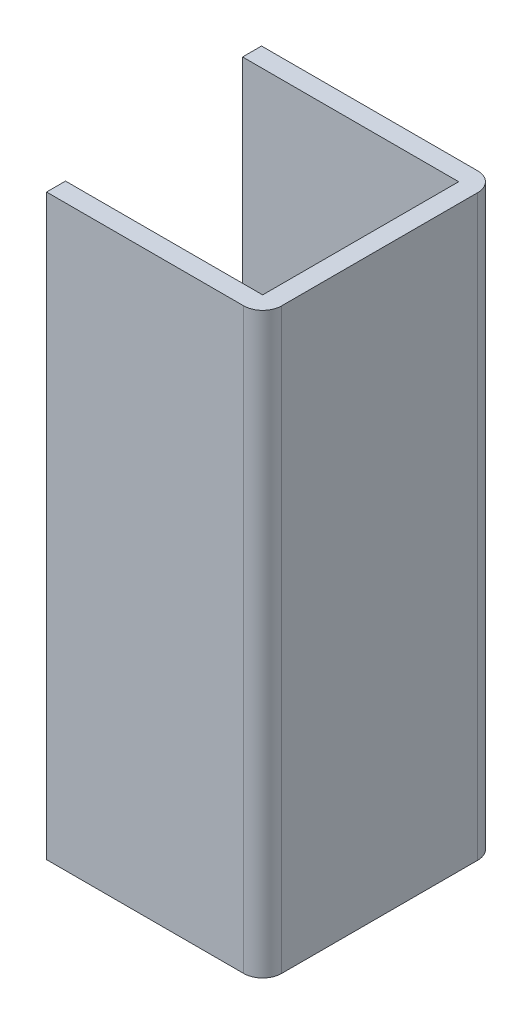
ISO-10303-21;
HEADER;
FILE_DESCRIPTION(('STEP AP214'),'2;1');
FILE_NAME('part.step','',(''),(''),'','','');
FILE_SCHEMA(('AUTOMOTIVE_DESIGN { 1 0 10303 214 1 1 1 1 }'));
ENDSEC;
DATA;
#1=APPLICATION_CONTEXT('core data for automotive mechanical design processes');
#2=APPLICATION_PROTOCOL_DEFINITION('international standard','automotive_design',2000,#1);
#3=PRODUCT_CONTEXT('',#1,'mechanical');
#4=PRODUCT('Part','Part','',(#3));
#5=PRODUCT_RELATED_PRODUCT_CATEGORY('part','',(#4));
#6=PRODUCT_DEFINITION_FORMATION('','',#4);
#7=PRODUCT_DEFINITION_CONTEXT('part definition',#1,'design');
#8=PRODUCT_DEFINITION('design','',#6,#7);
#9=PRODUCT_DEFINITION_SHAPE('','',#8);
#10=(LENGTH_UNIT() NAMED_UNIT(*) SI_UNIT(.MILLI.,.METRE.));
#11=(NAMED_UNIT(*) PLANE_ANGLE_UNIT() SI_UNIT($,.RADIAN.));
#12=(NAMED_UNIT(*) SI_UNIT($,.STERADIAN.) SOLID_ANGLE_UNIT());
#13=UNCERTAINTY_MEASURE_WITH_UNIT(LENGTH_MEASURE(1.E-05),#10,'distance_accuracy_value','');
#14=(GEOMETRIC_REPRESENTATION_CONTEXT(3) GLOBAL_UNCERTAINTY_ASSIGNED_CONTEXT((#13)) GLOBAL_UNIT_ASSIGNED_CONTEXT((#10,
#11,#12)) REPRESENTATION_CONTEXT('',''));
#15=CARTESIAN_POINT('',(0.,0.,0.));
#16=DIRECTION('',(0.,0.,1.));
#17=DIRECTION('',(1.,0.,0.));
#18=AXIS2_PLACEMENT_3D('',#15,#16,#17);
#19=CARTESIAN_POINT('',(2.83,-1.525,1.134));
#20=DIRECTION('',(1.,0.,0.));
#21=DIRECTION('',(0.,0.,-1.));
#22=AXIS2_PLACEMENT_3D('',#19,#20,#21);
#23=PLANE('',#22);
#24=DIRECTION('',(0.,0.,-1.));
#25=VECTOR('',#24,1.);
#26=CARTESIAN_POINT('',(2.83,1.525,1.134));
#27=LINE('',#26,#25);
#28=CARTESIAN_POINT('',(2.83,1.525,1.134));
#29=VERTEX_POINT('',#28);
#30=CARTESIAN_POINT('',(2.83,1.525,1.234));
#31=VERTEX_POINT('',#30);
#32=EDGE_CURVE('E117',#29,#31,#27,.F.);
#33=ORIENTED_EDGE('',*,*,#32,.F.);
#34=DIRECTION('',(0.,1.,0.));
#35=VECTOR('',#34,1.);
#36=CARTESIAN_POINT('',(2.83,-1.525,1.134));
#37=LINE('',#36,#35);
#38=CARTESIAN_POINT('',(2.83,-1.525,1.134));
#39=VERTEX_POINT('',#38);
#40=EDGE_CURVE('E115',#29,#39,#37,.F.);
#41=ORIENTED_EDGE('',*,*,#40,.T.);
#42=DIRECTION('',(0.,0.,-1.));
#43=VECTOR('',#42,1.);
#44=CARTESIAN_POINT('',(2.83,-1.525,1.134));
#45=LINE('',#44,#43);
#46=CARTESIAN_POINT('',(2.83,-1.525,1.234));
#47=VERTEX_POINT('',#46);
#48=EDGE_CURVE('E96',#47,#39,#45,.T.);
#49=ORIENTED_EDGE('',*,*,#48,.F.);
#50=DIRECTION('',(0.,1.,0.));
#51=VECTOR('',#50,1.);
#52=CARTESIAN_POINT('',(2.83,0.,1.234));
#53=LINE('',#52,#51);
#54=EDGE_CURVE('E112',#31,#47,#53,.F.);
#55=ORIENTED_EDGE('',*,*,#54,.F.);
#56=EDGE_LOOP('',(#33,#41,#49,#55));
#57=FACE_BOUND('',#56,.T.);
#58=ADVANCED_FACE('F17',(#57),#23,.F.);
#59=CARTESIAN_POINT('',(2.83,-1.525,1.134));
#60=DIRECTION('',(0.,0.,1.));
#61=DIRECTION('',(1.,0.,0.));
#62=AXIS2_PLACEMENT_3D('',#59,#60,#61);
#63=PLANE('',#62);
#64=DIRECTION('',(0.,1.,0.));
#65=VECTOR('',#64,1.);
#66=CARTESIAN_POINT('',(3.87,-1.525,1.134));
#67=LINE('',#66,#65);
#68=CARTESIAN_POINT('',(3.87,1.525,1.134));
#69=VERTEX_POINT('',#68);
#70=CARTESIAN_POINT('',(3.87,-1.525,1.134));
#71=VERTEX_POINT('',#70);
#72=EDGE_CURVE('E153',#69,#71,#67,.F.);
#73=ORIENTED_EDGE('',*,*,#72,.T.);
#74=DIRECTION('',(1.,0.,0.));
#75=VECTOR('',#74,1.);
#76=CARTESIAN_POINT('',(2.83,-1.525,1.134));
#77=LINE('',#76,#75);
#78=EDGE_CURVE('E137',#39,#71,#77,.T.);
#79=ORIENTED_EDGE('',*,*,#78,.F.);
#80=ORIENTED_EDGE('',*,*,#40,.F.);
#81=DIRECTION('',(1.,0.,0.));
#82=VECTOR('',#81,1.);
#83=CARTESIAN_POINT('',(2.83,1.525,1.134));
#84=LINE('',#83,#82);
#85=EDGE_CURVE('E108',#69,#29,#84,.F.);
#86=ORIENTED_EDGE('',*,*,#85,.F.);
#87=EDGE_LOOP('',(#73,#79,#80,#86));
#88=FACE_BOUND('',#87,.T.);
#89=ADVANCED_FACE('F174',(#88),#63,.F.);
#90=CARTESIAN_POINT('',(3.4,0.,1.234));
#91=DIRECTION('',(0.,0.,1.));
#92=DIRECTION('',(1.,0.,0.));
#93=AXIS2_PLACEMENT_3D('',#90,#91,#92);
#94=PLANE('',#93);
#95=DIRECTION('',(1.,0.,0.));
#96=VECTOR('',#95,1.);
#97=CARTESIAN_POINT('',(3.4,1.525,1.234));
#98=LINE('',#97,#96);
#99=CARTESIAN_POINT('',(3.87,1.525,1.234));
#100=VERTEX_POINT('',#99);
#101=EDGE_CURVE('E107',#100,#31,#98,.F.);
#102=ORIENTED_EDGE('',*,*,#101,.T.);
#103=ORIENTED_EDGE('',*,*,#54,.T.);
#104=DIRECTION('',(1.,0.,0.));
#105=VECTOR('',#104,1.);
#106=CARTESIAN_POINT('',(3.4,-1.525,1.234));
#107=LINE('',#106,#105);
#108=CARTESIAN_POINT('',(3.87,-1.525,1.234));
#109=VERTEX_POINT('',#108);
#110=EDGE_CURVE('E99',#47,#109,#107,.T.);
#111=ORIENTED_EDGE('',*,*,#110,.T.);
#112=DIRECTION('',(0.,1.,0.));
#113=VECTOR('',#112,1.);
#114=CARTESIAN_POINT('',(3.87,-1.525,1.234));
#115=LINE('',#114,#113);
#116=EDGE_CURVE('E146',#100,#109,#115,.F.);
#117=ORIENTED_EDGE('',*,*,#116,.F.);
#118=EDGE_LOOP('',(#102,#103,#111,#117));
#119=FACE_BOUND('',#118,.T.);
#120=ADVANCED_FACE('F119',(#119),#94,.T.);
#121=CARTESIAN_POINT('',(3.87,-1.525,0.));
#122=DIRECTION('',(1.,0.,0.));
#123=DIRECTION('',(0.,0.,-1.));
#124=AXIS2_PLACEMENT_3D('',#121,#122,#123);
#125=PLANE('',#124);
#126=DIRECTION('',(0.,0.,-1.));
#127=VECTOR('',#126,1.);
#128=CARTESIAN_POINT('',(3.87,1.525,0.));
#129=LINE('',#128,#127);
#130=CARTESIAN_POINT('',(3.87,1.525,0.1));
#131=VERTEX_POINT('',#130);
#132=EDGE_CURVE('E122',#131,#69,#129,.F.);
#133=ORIENTED_EDGE('',*,*,#132,.F.);
#134=DIRECTION('',(0.,1.,0.));
#135=VECTOR('',#134,1.);
#136=CARTESIAN_POINT('',(3.87,-1.525,0.1));
#137=LINE('',#136,#135);
#138=CARTESIAN_POINT('',(3.87,-1.525,0.1));
#139=VERTEX_POINT('',#138);
#140=EDGE_CURVE('E145',#139,#131,#137,.T.);
#141=ORIENTED_EDGE('',*,*,#140,.F.);
#142=DIRECTION('',(0.,0.,-1.));
#143=VECTOR('',#142,1.);
#144=CARTESIAN_POINT('',(3.87,-1.525,0.));
#145=LINE('',#144,#143);
#146=EDGE_CURVE('E120',#71,#139,#145,.T.);
#147=ORIENTED_EDGE('',*,*,#146,.F.);
#148=ORIENTED_EDGE('',*,*,#72,.F.);
#149=EDGE_LOOP('',(#133,#141,#147,#148));
#150=FACE_BOUND('',#149,.T.);
#151=ADVANCED_FACE('F176',(#150),#125,.F.);
#152=CARTESIAN_POINT('',(3.87,-1.525,1.134));
#153=DIRECTION('',(0.,1.,0.));
#154=DIRECTION('',(0.,0.,1.));
#155=AXIS2_PLACEMENT_3D('',#152,#153,#154);
#156=CYLINDRICAL_SURFACE('',#155,0.1);
#157=ORIENTED_EDGE('',*,*,#116,.T.);
#158=CARTESIAN_POINT('',(3.87,-1.525,1.134));
#159=DIRECTION('',(0.,1.,0.));
#160=DIRECTION('',(0.,0.,1.));
#161=AXIS2_PLACEMENT_3D('',#158,#159,#160);
#162=CIRCLE('',#161,0.1);
#163=CARTESIAN_POINT('',(3.97,-1.525,1.134));
#164=VERTEX_POINT('',#163);
#165=EDGE_CURVE('E102',#109,#164,#162,.T.);
#166=ORIENTED_EDGE('',*,*,#165,.T.);
#167=DIRECTION('',(0.,1.,0.));
#168=VECTOR('',#167,1.);
#169=CARTESIAN_POINT('',(3.97,-1.525,1.134));
#170=LINE('',#169,#168);
#171=CARTESIAN_POINT('',(3.97,1.525,1.134));
#172=VERTEX_POINT('',#171);
#173=EDGE_CURVE('E187',#172,#164,#170,.F.);
#174=ORIENTED_EDGE('',*,*,#173,.F.);
#175=CARTESIAN_POINT('',(3.87,1.525,1.134));
#176=DIRECTION('',(0.,1.,0.));
#177=DIRECTION('',(0.,0.,1.));
#178=AXIS2_PLACEMENT_3D('',#175,#176,#177);
#179=CIRCLE('',#178,0.1);
#180=EDGE_CURVE('E20',#172,#100,#179,.F.);
#181=ORIENTED_EDGE('',*,*,#180,.T.);
#182=EDGE_LOOP('',(#157,#166,#174,#181));
#183=FACE_BOUND('',#182,.T.);
#184=ADVANCED_FACE('F292',(#183),#156,.T.);
#185=CARTESIAN_POINT('',(2.73,-1.525,0.1));
#186=DIRECTION('',(0.,0.,1.));
#187=DIRECTION('',(1.,0.,0.));
#188=AXIS2_PLACEMENT_3D('',#185,#186,#187);
#189=PLANE('',#188);
#190=ORIENTED_EDGE('',*,*,#140,.T.);
#191=DIRECTION('',(1.,0.,0.));
#192=VECTOR('',#191,1.);
#193=CARTESIAN_POINT('',(2.73,1.525,0.1));
#194=LINE('',#193,#192);
#195=CARTESIAN_POINT('',(2.73,1.525,0.1));
#196=VERTEX_POINT('',#195);
#197=EDGE_CURVE('E150',#131,#196,#194,.F.);
#198=ORIENTED_EDGE('',*,*,#197,.T.);
#199=DIRECTION('',(0.,1.,0.));
#200=VECTOR('',#199,1.);
#201=CARTESIAN_POINT('',(2.73,-1.525,0.1));
#202=LINE('',#201,#200);
#203=CARTESIAN_POINT('',(2.73,-1.525,0.1));
#204=VERTEX_POINT('',#203);
#205=EDGE_CURVE('E181',#196,#204,#202,.F.);
#206=ORIENTED_EDGE('',*,*,#205,.T.);
#207=DIRECTION('',(1.,0.,0.));
#208=VECTOR('',#207,1.);
#209=CARTESIAN_POINT('',(3.519146272055,-1.525,0.1));
#210=LINE('',#209,#208);
#211=EDGE_CURVE('E74',#139,#204,#210,.F.);
#212=ORIENTED_EDGE('',*,*,#211,.F.);
#213=EDGE_LOOP('',(#190,#198,#206,#212));
#214=FACE_BOUND('',#213,.T.);
#215=ADVANCED_FACE('F179',(#214),#189,.T.);
#216=CARTESIAN_POINT('',(3.97,-1.525,0.));
#217=DIRECTION('',(1.,0.,0.));
#218=DIRECTION('',(0.,0.,-1.));
#219=AXIS2_PLACEMENT_3D('',#216,#217,#218);
#220=PLANE('',#219);
#221=DIRECTION('',(0.,0.,1.));
#222=VECTOR('',#221,1.);
#223=CARTESIAN_POINT('',(3.97,1.525,0.600864541833));
#224=LINE('',#223,#222);
#225=CARTESIAN_POINT('',(3.97,1.525,0.1));
#226=VERTEX_POINT('',#225);
#227=EDGE_CURVE('E205',#172,#226,#224,.F.);
#228=ORIENTED_EDGE('',*,*,#227,.F.);
#229=ORIENTED_EDGE('',*,*,#173,.T.);
#230=DIRECTION('',(0.,0.,1.));
#231=VECTOR('',#230,1.);
#232=CARTESIAN_POINT('',(3.97,-1.525,0.600864541833));
#233=LINE('',#232,#231);
#234=CARTESIAN_POINT('',(3.97,-1.525,0.1));
#235=VERTEX_POINT('',#234);
#236=EDGE_CURVE('E184',#235,#164,#233,.T.);
#237=ORIENTED_EDGE('',*,*,#236,.F.);
#238=DIRECTION('',(0.,1.,0.));
#239=VECTOR('',#238,1.);
#240=CARTESIAN_POINT('',(3.97,-1.525,0.1));
#241=LINE('',#240,#239);
#242=EDGE_CURVE('E141',#226,#235,#241,.F.);
#243=ORIENTED_EDGE('',*,*,#242,.F.);
#244=EDGE_LOOP('',(#228,#229,#237,#243));
#245=FACE_BOUND('',#244,.T.);
#246=ADVANCED_FACE('F230',(#245),#220,.T.);
#247=CARTESIAN_POINT('',(3.519146272055,-1.525,0.600864541833));
#248=DIRECTION('',(0.,-1.,0.));
#249=DIRECTION('',(1.,0.,0.));
#250=AXIS2_PLACEMENT_3D('',#247,#248,#249);
#251=PLANE('',#250);
#252=ORIENTED_EDGE('',*,*,#211,.T.);
#253=DIRECTION('',(0.,0.,-1.));
#254=VECTOR('',#253,1.);
#255=CARTESIAN_POINT('',(2.73,-1.525,0.));
#256=LINE('',#255,#254);
#257=CARTESIAN_POINT('',(2.73,-1.525,0.));
#258=VERTEX_POINT('',#257);
#259=EDGE_CURVE('E183',#204,#258,#256,.T.);
#260=ORIENTED_EDGE('',*,*,#259,.T.);
#261=DIRECTION('',(-1.,0.,0.));
#262=VECTOR('',#261,1.);
#263=CARTESIAN_POINT('',(3.35,-1.525,0.));
#264=LINE('',#263,#262);
#265=CARTESIAN_POINT('',(3.87,-1.525,0.));
#266=VERTEX_POINT('',#265);
#267=EDGE_CURVE('E207',#266,#258,#264,.T.);
#268=ORIENTED_EDGE('',*,*,#267,.F.);
#269=CARTESIAN_POINT('',(3.87,-1.525,0.1));
#270=DIRECTION('',(0.,1.,0.));
#271=DIRECTION('',(0.,0.,1.));
#272=AXIS2_PLACEMENT_3D('',#269,#270,#271);
#273=CIRCLE('',#272,0.1);
#274=EDGE_CURVE('E142',#235,#266,#273,.T.);
#275=ORIENTED_EDGE('',*,*,#274,.F.);
#276=ORIENTED_EDGE('',*,*,#236,.T.);
#277=ORIENTED_EDGE('',*,*,#165,.F.);
#278=ORIENTED_EDGE('',*,*,#110,.F.);
#279=ORIENTED_EDGE('',*,*,#48,.T.);
#280=ORIENTED_EDGE('',*,*,#78,.T.);
#281=ORIENTED_EDGE('',*,*,#146,.T.);
#282=EDGE_LOOP('',(#252,#260,#268,#275,#276,#277,#278,#279,#280,#281));
#283=FACE_BOUND('',#282,.T.);
#284=ADVANCED_FACE('F100',(#283),#251,.T.);
#285=CARTESIAN_POINT('',(2.73,-1.525,0.));
#286=DIRECTION('',(1.,0.,0.));
#287=DIRECTION('',(0.,0.,-1.));
#288=AXIS2_PLACEMENT_3D('',#285,#286,#287);
#289=PLANE('',#288);
#290=DIRECTION('',(0.,0.,1.));
#291=VECTOR('',#290,1.);
#292=CARTESIAN_POINT('',(2.73,1.525,0.600864541833));
#293=LINE('',#292,#291);
#294=CARTESIAN_POINT('',(2.73,1.525,0.));
#295=VERTEX_POINT('',#294);
#296=EDGE_CURVE('E144',#295,#196,#293,.T.);
#297=ORIENTED_EDGE('',*,*,#296,.F.);
#298=DIRECTION('',(0.,1.,0.));
#299=VECTOR('',#298,1.);
#300=CARTESIAN_POINT('',(2.73,0.,0.));
#301=LINE('',#300,#299);
#302=EDGE_CURVE('E213',#258,#295,#301,.T.);
#303=ORIENTED_EDGE('',*,*,#302,.F.);
#304=ORIENTED_EDGE('',*,*,#259,.F.);
#305=ORIENTED_EDGE('',*,*,#205,.F.);
#306=EDGE_LOOP('',(#297,#303,#304,#305));
#307=FACE_BOUND('',#306,.T.);
#308=ADVANCED_FACE('F238',(#307),#289,.F.);
#309=CARTESIAN_POINT('',(3.519146272055,1.525,0.600864541833));
#310=DIRECTION('',(0.,1.,0.));
#311=DIRECTION('',(-1.,0.,0.));
#312=AXIS2_PLACEMENT_3D('',#309,#310,#311);
#313=PLANE('',#312);
#314=ORIENTED_EDGE('',*,*,#85,.T.);
#315=ORIENTED_EDGE('',*,*,#32,.T.);
#316=ORIENTED_EDGE('',*,*,#101,.F.);
#317=ORIENTED_EDGE('',*,*,#180,.F.);
#318=ORIENTED_EDGE('',*,*,#227,.T.);
#319=CARTESIAN_POINT('',(3.87,1.525,0.1));
#320=DIRECTION('',(0.,1.,0.));
#321=DIRECTION('',(0.,0.,1.));
#322=AXIS2_PLACEMENT_3D('',#319,#320,#321);
#323=CIRCLE('',#322,0.1);
#324=CARTESIAN_POINT('',(3.87,1.525,0.));
#325=VERTEX_POINT('',#324);
#326=EDGE_CURVE('E35',#325,#226,#323,.F.);
#327=ORIENTED_EDGE('',*,*,#326,.F.);
#328=DIRECTION('',(-1.,0.,0.));
#329=VECTOR('',#328,1.);
#330=CARTESIAN_POINT('',(3.35,1.525,0.));
#331=LINE('',#330,#329);
#332=EDGE_CURVE('E26',#295,#325,#331,.F.);
#333=ORIENTED_EDGE('',*,*,#332,.F.);
#334=ORIENTED_EDGE('',*,*,#296,.T.);
#335=ORIENTED_EDGE('',*,*,#197,.F.);
#336=ORIENTED_EDGE('',*,*,#132,.T.);
#337=EDGE_LOOP('',(#314,#315,#316,#317,#318,#327,#333,#334,#335,#336));
#338=FACE_BOUND('',#337,.T.);
#339=ADVANCED_FACE('F198',(#338),#313,.T.);
#340=CARTESIAN_POINT('',(3.87,-1.525,0.1));
#341=DIRECTION('',(0.,1.,0.));
#342=DIRECTION('',(0.,0.,1.));
#343=AXIS2_PLACEMENT_3D('',#340,#341,#342);
#344=CYLINDRICAL_SURFACE('',#343,0.1);
#345=ORIENTED_EDGE('',*,*,#326,.T.);
#346=ORIENTED_EDGE('',*,*,#242,.T.);
#347=ORIENTED_EDGE('',*,*,#274,.T.);
#348=DIRECTION('',(0.,1.,0.));
#349=VECTOR('',#348,1.);
#350=CARTESIAN_POINT('',(3.87,0.,0.));
#351=LINE('',#350,#349);
#352=EDGE_CURVE('E11',#325,#266,#351,.F.);
#353=ORIENTED_EDGE('',*,*,#352,.F.);
#354=EDGE_LOOP('',(#345,#346,#347,#353));
#355=FACE_BOUND('',#354,.T.);
#356=ADVANCED_FACE('F233',(#355),#344,.T.);
#357=CARTESIAN_POINT('',(3.35,0.,0.));
#358=DIRECTION('',(0.,0.,-1.));
#359=DIRECTION('',(-1.,0.,0.));
#360=AXIS2_PLACEMENT_3D('',#357,#358,#359);
#361=PLANE('',#360);
#362=ORIENTED_EDGE('',*,*,#332,.T.);
#363=ORIENTED_EDGE('',*,*,#352,.T.);
#364=ORIENTED_EDGE('',*,*,#267,.T.);
#365=ORIENTED_EDGE('',*,*,#302,.T.);
#366=EDGE_LOOP('',(#362,#363,#364,#365));
#367=FACE_BOUND('',#366,.T.);
#368=ADVANCED_FACE('F235',(#367),#361,.T.);
#369=CLOSED_SHELL('',(#58,#89,#120,#151,#184,#215,#246,#284,#308,#339,#356,#368));
#370=MANIFOLD_SOLID_BREP('B1',#369);
#371=ADVANCED_BREP_SHAPE_REPRESENTATION('',(#18,#370),#14);
#372=SHAPE_DEFINITION_REPRESENTATION(#9,#371);
ENDSEC;
END-ISO-10303-21;
